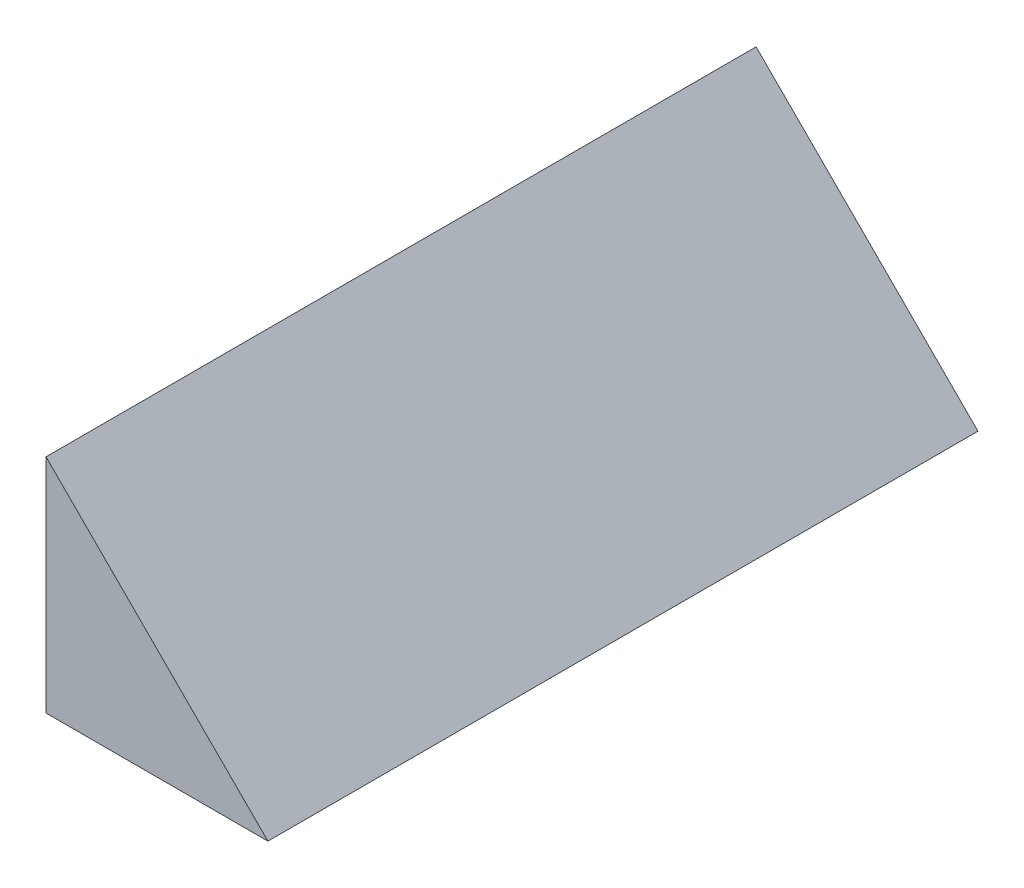
ISO-10303-21;
HEADER;
FILE_DESCRIPTION(('STEP AP214'),'2;1');
FILE_NAME('part.step','',(''),(''),'','','');
FILE_SCHEMA(('AUTOMOTIVE_DESIGN { 1 0 10303 214 1 1 1 1 }'));
ENDSEC;
DATA;
#1=APPLICATION_CONTEXT('core data for automotive mechanical design processes');
#2=APPLICATION_PROTOCOL_DEFINITION('international standard','automotive_design',2000,#1);
#3=PRODUCT_CONTEXT('',#1,'mechanical');
#4=PRODUCT('Part','Part','',(#3));
#5=PRODUCT_RELATED_PRODUCT_CATEGORY('part','',(#4));
#6=PRODUCT_DEFINITION_FORMATION('','',#4);
#7=PRODUCT_DEFINITION_CONTEXT('part definition',#1,'design');
#8=PRODUCT_DEFINITION('design','',#6,#7);
#9=PRODUCT_DEFINITION_SHAPE('','',#8);
#10=(LENGTH_UNIT() NAMED_UNIT(*) SI_UNIT(.MILLI.,.METRE.));
#11=(NAMED_UNIT(*) PLANE_ANGLE_UNIT() SI_UNIT($,.RADIAN.));
#12=(NAMED_UNIT(*) SI_UNIT($,.STERADIAN.) SOLID_ANGLE_UNIT());
#13=UNCERTAINTY_MEASURE_WITH_UNIT(LENGTH_MEASURE(1.E-05),#10,'distance_accuracy_value','');
#14=(GEOMETRIC_REPRESENTATION_CONTEXT(3) GLOBAL_UNCERTAINTY_ASSIGNED_CONTEXT((#13)) GLOBAL_UNIT_ASSIGNED_CONTEXT((#10,
#11,#12)) REPRESENTATION_CONTEXT('',''));
#15=CARTESIAN_POINT('',(0.,0.,0.));
#16=DIRECTION('',(0.,0.,1.));
#17=DIRECTION('',(1.,0.,0.));
#18=AXIS2_PLACEMENT_3D('',#15,#16,#17);
#19=CARTESIAN_POINT('',(0.,0.,0.8));
#20=DIRECTION('',(0.,1.,0.));
#21=DIRECTION('',(0.,0.,1.));
#22=AXIS2_PLACEMENT_3D('',#19,#20,#21);
#23=PLANE('',#22);
#24=DIRECTION('',(1.,0.,0.));
#25=VECTOR('',#24,1.);
#26=CARTESIAN_POINT('',(0.,0.,0.));
#27=LINE('',#26,#25);
#28=CARTESIAN_POINT('',(0.,0.,0.));
#29=VERTEX_POINT('',#28);
#30=CARTESIAN_POINT('',(0.25,0.,0.));
#31=VERTEX_POINT('',#30);
#32=EDGE_CURVE('E82',#29,#31,#27,.T.);
#33=ORIENTED_EDGE('',*,*,#32,.T.);
#34=DIRECTION('',(0.,0.,-1.));
#35=VECTOR('',#34,1.);
#36=CARTESIAN_POINT('',(0.25,0.,0.8));
#37=LINE('',#36,#35);
#38=CARTESIAN_POINT('',(0.25,0.,0.8));
#39=VERTEX_POINT('',#38);
#40=EDGE_CURVE('E11',#39,#31,#37,.T.);
#41=ORIENTED_EDGE('',*,*,#40,.F.);
#42=DIRECTION('',(1.,0.,0.));
#43=VECTOR('',#42,1.);
#44=CARTESIAN_POINT('',(0.,0.,0.8));
#45=LINE('',#44,#43);
#46=CARTESIAN_POINT('',(0.,0.,0.8));
#47=VERTEX_POINT('',#46);
#48=EDGE_CURVE('E75',#47,#39,#45,.T.);
#49=ORIENTED_EDGE('',*,*,#48,.F.);
#50=DIRECTION('',(0.,0.,-1.));
#51=VECTOR('',#50,1.);
#52=CARTESIAN_POINT('',(0.,0.,0.8));
#53=LINE('',#52,#51);
#54=EDGE_CURVE('E83',#47,#29,#53,.T.);
#55=ORIENTED_EDGE('',*,*,#54,.T.);
#56=EDGE_LOOP('',(#33,#41,#49,#55));
#57=FACE_BOUND('',#56,.T.);
#58=ADVANCED_FACE('F35',(#57),#23,.F.);
#59=CARTESIAN_POINT('',(0.,0.25,0.8));
#60=DIRECTION('',(-0.707106781186548,-0.707106781186548,0.));
#61=DIRECTION('',(0.707106781186548,-0.707106781186548,0.));
#62=AXIS2_PLACEMENT_3D('',#59,#60,#61);
#63=PLANE('',#62);
#64=DIRECTION('',(-0.707106781186548,0.707106781186548,0.));
#65=VECTOR('',#64,1.);
#66=CARTESIAN_POINT('',(0.,0.25,0.));
#67=LINE('',#66,#65);
#68=CARTESIAN_POINT('',(0.,0.25,0.));
#69=VERTEX_POINT('',#68);
#70=EDGE_CURVE('E63',#31,#69,#67,.T.);
#71=ORIENTED_EDGE('',*,*,#70,.T.);
#72=DIRECTION('',(0.,0.,-1.));
#73=VECTOR('',#72,1.);
#74=CARTESIAN_POINT('',(0.,0.25,0.8));
#75=LINE('',#74,#73);
#76=CARTESIAN_POINT('',(0.,0.25,0.8));
#77=VERTEX_POINT('',#76);
#78=EDGE_CURVE('E43',#77,#69,#75,.T.);
#79=ORIENTED_EDGE('',*,*,#78,.F.);
#80=DIRECTION('',(-0.707106781186548,0.707106781186548,0.));
#81=VECTOR('',#80,1.);
#82=CARTESIAN_POINT('',(0.,0.25,0.8));
#83=LINE('',#82,#81);
#84=EDGE_CURVE('E71',#39,#77,#83,.T.);
#85=ORIENTED_EDGE('',*,*,#84,.F.);
#86=ORIENTED_EDGE('',*,*,#40,.T.);
#87=EDGE_LOOP('',(#71,#79,#85,#86));
#88=FACE_BOUND('',#87,.T.);
#89=ADVANCED_FACE('F72',(#88),#63,.F.);
#90=CARTESIAN_POINT('',(0.,0.,0.8));
#91=DIRECTION('',(1.,0.,0.));
#92=DIRECTION('',(0.,0.,-1.));
#93=AXIS2_PLACEMENT_3D('',#90,#91,#92);
#94=PLANE('',#93);
#95=DIRECTION('',(0.,-1.,0.));
#96=VECTOR('',#95,1.);
#97=CARTESIAN_POINT('',(0.,0.,0.));
#98=LINE('',#97,#96);
#99=EDGE_CURVE('E68',#69,#29,#98,.T.);
#100=ORIENTED_EDGE('',*,*,#99,.T.);
#101=ORIENTED_EDGE('',*,*,#54,.F.);
#102=DIRECTION('',(0.,-1.,0.));
#103=VECTOR('',#102,1.);
#104=CARTESIAN_POINT('',(0.,0.,0.8));
#105=LINE('',#104,#103);
#106=EDGE_CURVE('E51',#77,#47,#105,.T.);
#107=ORIENTED_EDGE('',*,*,#106,.F.);
#108=ORIENTED_EDGE('',*,*,#78,.T.);
#109=EDGE_LOOP('',(#100,#101,#107,#108));
#110=FACE_BOUND('',#109,.T.);
#111=ADVANCED_FACE('F90',(#110),#94,.F.);
#112=CARTESIAN_POINT('',(0.,0.,0.8));
#113=DIRECTION('',(0.,0.,1.));
#114=DIRECTION('',(1.,0.,0.));
#115=AXIS2_PLACEMENT_3D('',#112,#113,#114);
#116=PLANE('',#115);
#117=ORIENTED_EDGE('',*,*,#48,.T.);
#118=ORIENTED_EDGE('',*,*,#84,.T.);
#119=ORIENTED_EDGE('',*,*,#106,.T.);
#120=EDGE_LOOP('',(#117,#118,#119));
#121=FACE_BOUND('',#120,.T.);
#122=ADVANCED_FACE('F78',(#121),#116,.T.);
#123=CARTESIAN_POINT('',(0.,0.,0.));
#124=DIRECTION('',(0.,0.,1.));
#125=DIRECTION('',(1.,0.,0.));
#126=AXIS2_PLACEMENT_3D('',#123,#124,#125);
#127=PLANE('',#126);
#128=ORIENTED_EDGE('',*,*,#32,.F.);
#129=ORIENTED_EDGE('',*,*,#99,.F.);
#130=ORIENTED_EDGE('',*,*,#70,.F.);
#131=EDGE_LOOP('',(#128,#129,#130));
#132=FACE_BOUND('',#131,.T.);
#133=ADVANCED_FACE('F91',(#132),#127,.F.);
#134=CLOSED_SHELL('',(#58,#89,#111,#122,#133));
#135=MANIFOLD_SOLID_BREP('B2',#134);
#136=ADVANCED_BREP_SHAPE_REPRESENTATION('',(#18,#135),#14);
#137=SHAPE_DEFINITION_REPRESENTATION(#9,#136);
ENDSEC;
END-ISO-10303-21;
